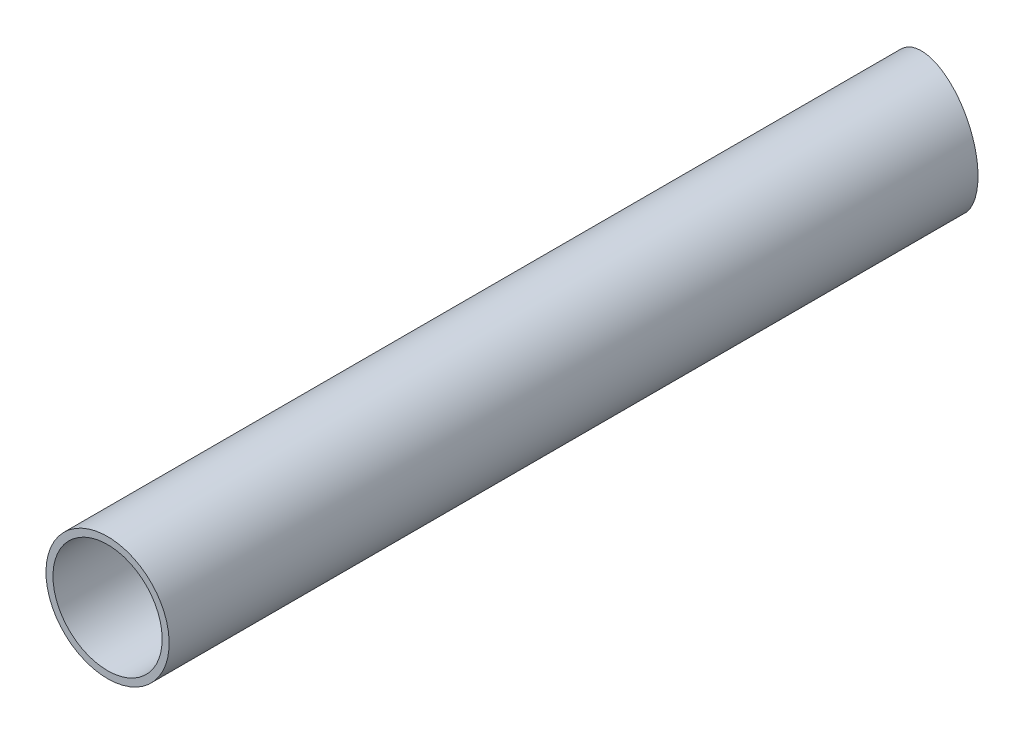
ISO-10303-21;
HEADER;
FILE_DESCRIPTION(('STEP AP214'),'2;1');
FILE_NAME('part.step','',(''),(''),'','','');
FILE_SCHEMA(('AUTOMOTIVE_DESIGN { 1 0 10303 214 1 1 1 1 }'));
ENDSEC;
DATA;
#1=APPLICATION_CONTEXT('core data for automotive mechanical design processes');
#2=APPLICATION_PROTOCOL_DEFINITION('international standard','automotive_design',2000,#1);
#3=PRODUCT_CONTEXT('',#1,'mechanical');
#4=PRODUCT('Part','Part','',(#3));
#5=PRODUCT_RELATED_PRODUCT_CATEGORY('part','',(#4));
#6=PRODUCT_DEFINITION_FORMATION('','',#4);
#7=PRODUCT_DEFINITION_CONTEXT('part definition',#1,'design');
#8=PRODUCT_DEFINITION('design','',#6,#7);
#9=PRODUCT_DEFINITION_SHAPE('','',#8);
#10=(LENGTH_UNIT() NAMED_UNIT(*) SI_UNIT(.MILLI.,.METRE.));
#11=(NAMED_UNIT(*) PLANE_ANGLE_UNIT() SI_UNIT($,.RADIAN.));
#12=(NAMED_UNIT(*) SI_UNIT($,.STERADIAN.) SOLID_ANGLE_UNIT());
#13=UNCERTAINTY_MEASURE_WITH_UNIT(LENGTH_MEASURE(1.E-05),#10,'distance_accuracy_value','');
#14=(GEOMETRIC_REPRESENTATION_CONTEXT(3) GLOBAL_UNCERTAINTY_ASSIGNED_CONTEXT((#13)) GLOBAL_UNIT_ASSIGNED_CONTEXT((#10,
#11,#12)) REPRESENTATION_CONTEXT('',''));
#15=CARTESIAN_POINT('',(0.,0.,0.));
#16=DIRECTION('',(0.,0.,1.));
#17=DIRECTION('',(1.,0.,0.));
#18=AXIS2_PLACEMENT_3D('',#15,#16,#17);
#19=CARTESIAN_POINT('',(19.0500000000001,19.05,-250.141135768374));
#20=DIRECTION('',(-0.258819045102518,0.,0.965925826289069));
#21=DIRECTION('',(0.965925826289069,0.,0.258819045102518));
#22=AXIS2_PLACEMENT_3D('',#19,#20,#21);
#23=PLANE('',#22);
#24=CARTESIAN_POINT('',(0.,0.,-255.245567884187));
#25=DIRECTION('',(-0.258819045102518,0.,0.965925826289069));
#26=DIRECTION('',(-0.965925826289069,0.,-0.258819045102518));
#27=AXIS2_PLACEMENT_3D('',#24,#25,#26);
#28=ELLIPSE('',#27,19.7220112368121,19.05);
#29=CARTESIAN_POINT('',(-19.05,0.,-260.35));
#30=VERTEX_POINT('',#29);
#31=EDGE_CURVE('E22',#30,#30,#28,.T.);
#32=ORIENTED_EDGE('',*,*,#31,.F.);
#33=EDGE_LOOP('',(#32));
#34=FACE_BOUND('',#33,.T.);
#35=CARTESIAN_POINT('',(0.,0.,-255.245567884187));
#36=DIRECTION('',(0.258819045102518,0.,-0.965925826289069));
#37=DIRECTION('',(-0.965925826289069,0.,-0.258819045102518));
#38=AXIS2_PLACEMENT_3D('',#35,#36,#37);
#39=ELLIPSE('',#38,17.4868499633067,16.891);
#40=CARTESIAN_POINT('',(-16.891,0.,-259.771497693541));
#41=VERTEX_POINT('',#40);
#42=EDGE_CURVE('E9',#41,#41,#39,.T.);
#43=ORIENTED_EDGE('',*,*,#42,.F.);
#44=EDGE_LOOP('',(#43));
#45=FACE_BOUND('',#44,.T.);
#46=ADVANCED_FACE('F14',(#34,#45),#23,.F.);
#47=CARTESIAN_POINT('',(0.,0.,0.));
#48=DIRECTION('',(0.,0.,-1.));
#49=DIRECTION('',(0.,-1.,0.));
#50=AXIS2_PLACEMENT_3D('',#47,#48,#49);
#51=CYLINDRICAL_SURFACE('',#50,16.891);
#52=ORIENTED_EDGE('',*,*,#42,.T.);
#53=EDGE_LOOP('',(#52));
#54=FACE_BOUND('',#53,.T.);
#55=CARTESIAN_POINT('',(0.,0.,0.));
#56=DIRECTION('',(0.,0.,-1.));
#57=DIRECTION('',(0.,-1.,0.));
#58=AXIS2_PLACEMENT_3D('',#55,#56,#57);
#59=CIRCLE('',#58,16.891);
#60=CARTESIAN_POINT('',(0.,-16.891,0.));
#61=VERTEX_POINT('',#60);
#62=EDGE_CURVE('E28',#61,#61,#59,.T.);
#63=ORIENTED_EDGE('',*,*,#62,.F.);
#64=EDGE_LOOP('',(#63));
#65=FACE_BOUND('',#64,.T.);
#66=ADVANCED_FACE('F16',(#54,#65),#51,.F.);
#67=CARTESIAN_POINT('',(0.,0.,0.));
#68=DIRECTION('',(0.,0.,-1.));
#69=DIRECTION('',(0.,-1.,0.));
#70=AXIS2_PLACEMENT_3D('',#67,#68,#69);
#71=CYLINDRICAL_SURFACE('',#70,19.05);
#72=ORIENTED_EDGE('',*,*,#31,.T.);
#73=EDGE_LOOP('',(#72));
#74=FACE_BOUND('',#73,.T.);
#75=CARTESIAN_POINT('',(0.,0.,0.));
#76=DIRECTION('',(0.,0.,-1.));
#77=DIRECTION('',(0.,-1.,0.));
#78=AXIS2_PLACEMENT_3D('',#75,#76,#77);
#79=CIRCLE('',#78,19.05);
#80=CARTESIAN_POINT('',(0.,-19.05,0.));
#81=VERTEX_POINT('',#80);
#82=EDGE_CURVE('E18',#81,#81,#79,.T.);
#83=ORIENTED_EDGE('',*,*,#82,.T.);
#84=EDGE_LOOP('',(#83));
#85=FACE_BOUND('',#84,.T.);
#86=ADVANCED_FACE('F35',(#74,#85),#71,.T.);
#87=CARTESIAN_POINT('',(0.,0.,0.));
#88=DIRECTION('',(0.,0.,1.));
#89=DIRECTION('',(1.,0.,0.));
#90=AXIS2_PLACEMENT_3D('',#87,#88,#89);
#91=PLANE('',#90);
#92=ORIENTED_EDGE('',*,*,#82,.F.);
#93=EDGE_LOOP('',(#92));
#94=FACE_BOUND('',#93,.T.);
#95=ORIENTED_EDGE('',*,*,#62,.T.);
#96=EDGE_LOOP('',(#95));
#97=FACE_BOUND('',#96,.T.);
#98=ADVANCED_FACE('F37',(#94,#97),#91,.T.);
#99=CLOSED_SHELL('',(#46,#66,#86,#98));
#100=MANIFOLD_SOLID_BREP('B1',#99);
#101=ADVANCED_BREP_SHAPE_REPRESENTATION('',(#18,#100),#14);
#102=SHAPE_DEFINITION_REPRESENTATION(#9,#101);
ENDSEC;
END-ISO-10303-21;
